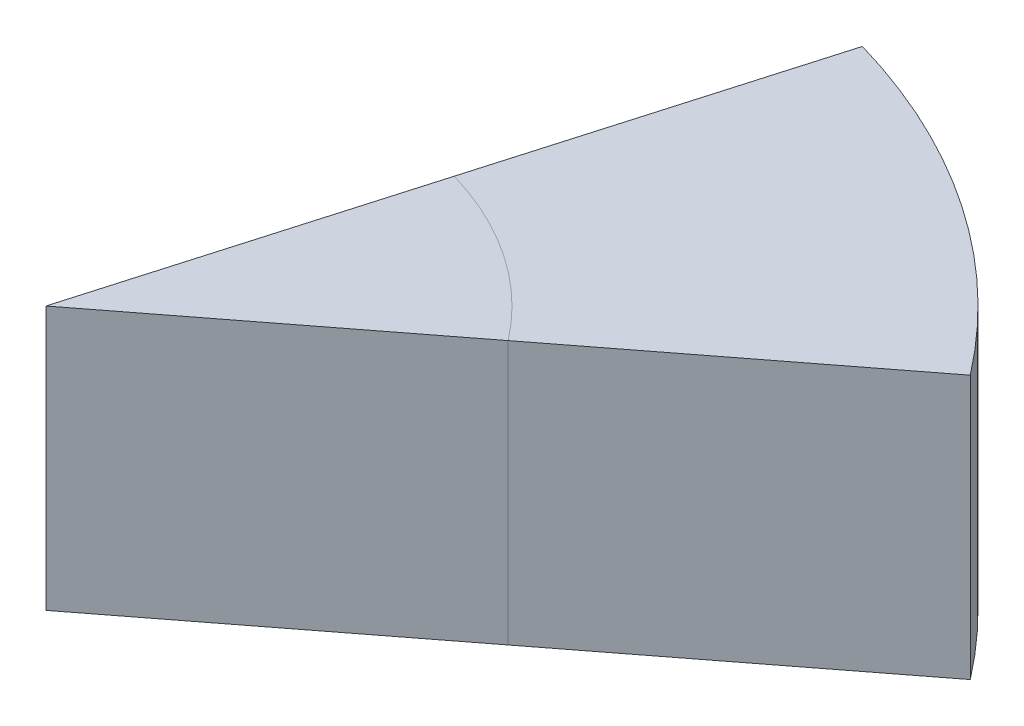
ISO-10303-21;
HEADER;
FILE_DESCRIPTION(('STEP AP214'),'2;1');
FILE_NAME('part.step','',(''),(''),'','','');
FILE_SCHEMA(('AUTOMOTIVE_DESIGN { 1 0 10303 214 1 1 1 1 }'));
ENDSEC;
DATA;
#1=APPLICATION_CONTEXT('core data for automotive mechanical design processes');
#2=APPLICATION_PROTOCOL_DEFINITION('international standard','automotive_design',2000,#1);
#3=PRODUCT_CONTEXT('',#1,'mechanical');
#4=PRODUCT('Part','Part','',(#3));
#5=PRODUCT_RELATED_PRODUCT_CATEGORY('part','',(#4));
#6=PRODUCT_DEFINITION_FORMATION('','',#4);
#7=PRODUCT_DEFINITION_CONTEXT('part definition',#1,'design');
#8=PRODUCT_DEFINITION('design','',#6,#7);
#9=PRODUCT_DEFINITION_SHAPE('','',#8);
#10=(LENGTH_UNIT() NAMED_UNIT(*) SI_UNIT(.MILLI.,.METRE.));
#11=(NAMED_UNIT(*) PLANE_ANGLE_UNIT() SI_UNIT($,.RADIAN.));
#12=(NAMED_UNIT(*) SI_UNIT($,.STERADIAN.) SOLID_ANGLE_UNIT());
#13=UNCERTAINTY_MEASURE_WITH_UNIT(LENGTH_MEASURE(1.E-05),#10,'distance_accuracy_value','');
#14=(GEOMETRIC_REPRESENTATION_CONTEXT(3) GLOBAL_UNCERTAINTY_ASSIGNED_CONTEXT((#13)) GLOBAL_UNIT_ASSIGNED_CONTEXT((#10,
#11,#12)) REPRESENTATION_CONTEXT('',''));
#15=CARTESIAN_POINT('',(0.,0.,0.));
#16=DIRECTION('',(0.,0.,1.));
#17=DIRECTION('',(1.,0.,0.));
#18=AXIS2_PLACEMENT_3D('',#15,#16,#17);
#19=CARTESIAN_POINT('',(0.,10.,0.));
#20=DIRECTION('',(0.960493630644656,0.,0.278301968176742));
#21=DIRECTION('',(0.278301968176742,0.,-0.960493630644656));
#22=AXIS2_PLACEMENT_3D('',#19,#20,#21);
#23=PLANE('',#22);
#24=DIRECTION('',(0.,1.,0.));
#25=VECTOR('',#24,1.);
#26=CARTESIAN_POINT('',(3.47877460220927,10.,-12.0061703830582));
#27=LINE('',#26,#25);
#28=CARTESIAN_POINT('',(3.47877460220927,0.,-12.0061703830582));
#29=VERTEX_POINT('',#28);
#30=CARTESIAN_POINT('',(3.47877460220927,10.,-12.0061703830582));
#31=VERTEX_POINT('',#30);
#32=EDGE_CURVE('E11',#29,#31,#27,.T.);
#33=ORIENTED_EDGE('',*,*,#32,.F.);
#34=DIRECTION('',(-0.278301968176742,0.,0.960493630644655));
#35=VECTOR('',#34,1.);
#36=CARTESIAN_POINT('',(0.,0.,0.));
#37=LINE('',#36,#35);
#38=CARTESIAN_POINT('',(0.,0.,0.));
#39=VERTEX_POINT('',#38);
#40=EDGE_CURVE('E150',#29,#39,#37,.T.);
#41=ORIENTED_EDGE('',*,*,#40,.T.);
#42=DIRECTION('',(0.,-1.,0.));
#43=VECTOR('',#42,1.);
#44=CARTESIAN_POINT('',(0.,10.,0.));
#45=LINE('',#44,#43);
#46=CARTESIAN_POINT('',(0.,10.,0.));
#47=VERTEX_POINT('',#46);
#48=EDGE_CURVE('E124',#47,#39,#45,.T.);
#49=ORIENTED_EDGE('',*,*,#48,.F.);
#50=DIRECTION('',(-0.278301968176742,0.,0.960493630644655));
#51=VECTOR('',#50,1.);
#52=CARTESIAN_POINT('',(0.,10.,0.));
#53=LINE('',#52,#51);
#54=EDGE_CURVE('E115',#31,#47,#53,.T.);
#55=ORIENTED_EDGE('',*,*,#54,.F.);
#56=EDGE_LOOP('',(#33,#41,#49,#55));
#57=FACE_BOUND('',#56,.T.);
#58=ADVANCED_FACE('F48',(#57),#23,.F.);
#59=CARTESIAN_POINT('',(0.,0.,0.));
#60=DIRECTION('',(0.,-1.,0.));
#61=DIRECTION('',(0.,0.,-1.));
#62=AXIS2_PLACEMENT_3D('',#59,#60,#61);
#63=PLANE('',#62);
#64=ORIENTED_EDGE('',*,*,#40,.F.);
#65=CARTESIAN_POINT('',(0.,0.,0.));
#66=DIRECTION('',(0.,-1.,0.));
#67=DIRECTION('',(0.,0.,-1.));
#68=AXIS2_PLACEMENT_3D('',#65,#66,#67);
#69=CIRCLE('',#68,12.5);
#70=CARTESIAN_POINT('',(9.90204351010609,0.,-7.62886192849011));
#71=VERTEX_POINT('',#70);
#72=EDGE_CURVE('E57',#29,#71,#69,.T.);
#73=ORIENTED_EDGE('',*,*,#72,.T.);
#74=DIRECTION('',(0.792163480808487,0.,-0.610308954279209));
#75=VECTOR('',#74,1.);
#76=CARTESIAN_POINT('',(0.,0.,0.));
#77=LINE('',#76,#75);
#78=EDGE_CURVE('E145',#39,#71,#77,.T.);
#79=ORIENTED_EDGE('',*,*,#78,.F.);
#80=EDGE_LOOP('',(#64,#73,#79));
#81=FACE_BOUND('',#80,.T.);
#82=ADVANCED_FACE('F158',(#81),#63,.T.);
#83=CARTESIAN_POINT('',(0.,10.,0.));
#84=DIRECTION('',(-0.610308954279209,0.,-0.792163480808487));
#85=DIRECTION('',(-0.792163480808487,0.,0.610308954279209));
#86=AXIS2_PLACEMENT_3D('',#83,#84,#85);
#87=PLANE('',#86);
#88=DIRECTION('',(0.,-1.,0.));
#89=VECTOR('',#88,1.);
#90=CARTESIAN_POINT('',(9.90204351010609,10.,-7.62886192849011));
#91=LINE('',#90,#89);
#92=CARTESIAN_POINT('',(9.90204351010609,10.,-7.62886192849011));
#93=VERTEX_POINT('',#92);
#94=EDGE_CURVE('E122',#93,#71,#91,.T.);
#95=ORIENTED_EDGE('',*,*,#94,.F.);
#96=DIRECTION('',(0.792163480808487,0.,-0.610308954279209));
#97=VECTOR('',#96,1.);
#98=CARTESIAN_POINT('',(0.,10.,0.));
#99=LINE('',#98,#97);
#100=EDGE_CURVE('E105',#47,#93,#99,.T.);
#101=ORIENTED_EDGE('',*,*,#100,.F.);
#102=ORIENTED_EDGE('',*,*,#48,.T.);
#103=ORIENTED_EDGE('',*,*,#78,.T.);
#104=EDGE_LOOP('',(#95,#101,#102,#103));
#105=FACE_BOUND('',#104,.T.);
#106=ADVANCED_FACE('F148',(#105),#87,.F.);
#107=CARTESIAN_POINT('',(0.,10.,0.));
#108=DIRECTION('',(0.,-1.,0.));
#109=DIRECTION('',(0.,0.,-1.));
#110=AXIS2_PLACEMENT_3D('',#107,#108,#109);
#111=PLANE('',#110);
#112=CARTESIAN_POINT('',(0.,10.,0.));
#113=DIRECTION('',(0.,-1.,0.));
#114=DIRECTION('',(0.,0.,-1.));
#115=AXIS2_PLACEMENT_3D('',#112,#113,#114);
#116=CIRCLE('',#115,12.5);
#117=EDGE_CURVE('E101',#31,#93,#116,.T.);
#118=ORIENTED_EDGE('',*,*,#117,.F.);
#119=ORIENTED_EDGE('',*,*,#54,.T.);
#120=ORIENTED_EDGE('',*,*,#100,.T.);
#121=EDGE_LOOP('',(#118,#119,#120));
#122=FACE_BOUND('',#121,.T.);
#123=ADVANCED_FACE('F157',(#122),#111,.F.);
#124=CARTESIAN_POINT('',(19.8040870202122,10.,-15.2577238569802));
#125=VERTEX_POINT('',#124);
#126=EDGE_CURVE('E94',#93,#125,#99,.T.);
#127=ORIENTED_EDGE('',*,*,#126,.F.);
#128=ORIENTED_EDGE('',*,*,#94,.T.);
#129=CARTESIAN_POINT('',(19.8040870202122,0.,-15.2577238569802));
#130=VERTEX_POINT('',#129);
#131=EDGE_CURVE('E118',#71,#130,#77,.T.);
#132=ORIENTED_EDGE('',*,*,#131,.T.);
#133=DIRECTION('',(0.,-1.,0.));
#134=VECTOR('',#133,1.);
#135=CARTESIAN_POINT('',(19.8040870202122,10.,-15.2577238569802));
#136=LINE('',#135,#134);
#137=EDGE_CURVE('E111',#125,#130,#136,.T.);
#138=ORIENTED_EDGE('',*,*,#137,.F.);
#139=EDGE_LOOP('',(#127,#128,#132,#138));
#140=FACE_BOUND('',#139,.T.);
#141=ADVANCED_FACE('F50',(#140),#87,.F.);
#142=CARTESIAN_POINT('',(0.,10.,0.));
#143=DIRECTION('',(0.,-1.,0.));
#144=DIRECTION('',(0.,0.,-1.));
#145=AXIS2_PLACEMENT_3D('',#142,#143,#144);
#146=CYLINDRICAL_SURFACE('',#145,25.);
#147=CARTESIAN_POINT('',(0.,0.,0.));
#148=DIRECTION('',(0.,1.,0.));
#149=DIRECTION('',(0.,0.,-1.));
#150=AXIS2_PLACEMENT_3D('',#147,#148,#149);
#151=CIRCLE('',#150,25.);
#152=CARTESIAN_POINT('',(6.95754920441854,0.,-24.0123407661164));
#153=VERTEX_POINT('',#152);
#154=EDGE_CURVE('E144',#130,#153,#151,.T.);
#155=ORIENTED_EDGE('',*,*,#154,.T.);
#156=DIRECTION('',(0.,-1.,0.));
#157=VECTOR('',#156,1.);
#158=CARTESIAN_POINT('',(6.95754920441854,10.,-24.0123407661164));
#159=LINE('',#158,#157);
#160=CARTESIAN_POINT('',(6.95754920441854,10.,-24.0123407661164));
#161=VERTEX_POINT('',#160);
#162=EDGE_CURVE('E113',#161,#153,#159,.T.);
#163=ORIENTED_EDGE('',*,*,#162,.F.);
#164=CARTESIAN_POINT('',(0.,10.,0.));
#165=DIRECTION('',(0.,1.,0.));
#166=DIRECTION('',(0.,0.,-1.));
#167=AXIS2_PLACEMENT_3D('',#164,#165,#166);
#168=CIRCLE('',#167,25.);
#169=EDGE_CURVE('E98',#125,#161,#168,.T.);
#170=ORIENTED_EDGE('',*,*,#169,.F.);
#171=ORIENTED_EDGE('',*,*,#137,.T.);
#172=EDGE_LOOP('',(#155,#163,#170,#171));
#173=FACE_BOUND('',#172,.T.);
#174=ADVANCED_FACE('F110',(#173),#146,.T.);
#175=EDGE_CURVE('E106',#153,#29,#37,.T.);
#176=ORIENTED_EDGE('',*,*,#175,.T.);
#177=ORIENTED_EDGE('',*,*,#32,.T.);
#178=EDGE_CURVE('E153',#161,#31,#53,.T.);
#179=ORIENTED_EDGE('',*,*,#178,.F.);
#180=ORIENTED_EDGE('',*,*,#162,.T.);
#181=EDGE_LOOP('',(#176,#177,#179,#180));
#182=FACE_BOUND('',#181,.T.);
#183=ADVANCED_FACE('F160',(#182),#23,.F.);
#184=ORIENTED_EDGE('',*,*,#178,.T.);
#185=ORIENTED_EDGE('',*,*,#117,.T.);
#186=ORIENTED_EDGE('',*,*,#126,.T.);
#187=ORIENTED_EDGE('',*,*,#169,.T.);
#188=EDGE_LOOP('',(#184,#185,#186,#187));
#189=FACE_BOUND('',#188,.T.);
#190=ADVANCED_FACE('F97',(#189),#111,.F.);
#191=ORIENTED_EDGE('',*,*,#72,.F.);
#192=ORIENTED_EDGE('',*,*,#175,.F.);
#193=ORIENTED_EDGE('',*,*,#154,.F.);
#194=ORIENTED_EDGE('',*,*,#131,.F.);
#195=EDGE_LOOP('',(#191,#192,#193,#194));
#196=FACE_BOUND('',#195,.T.);
#197=ADVANCED_FACE('F142',(#196),#63,.T.);
#198=CLOSED_SHELL('',(#58,#82,#106,#123,#141,#174,#183,#190,#197));
#199=MANIFOLD_SOLID_BREP('B2',#198);
#200=ADVANCED_BREP_SHAPE_REPRESENTATION('',(#18,#199),#14);
#201=SHAPE_DEFINITION_REPRESENTATION(#9,#200);
ENDSEC;
END-ISO-10303-21;
